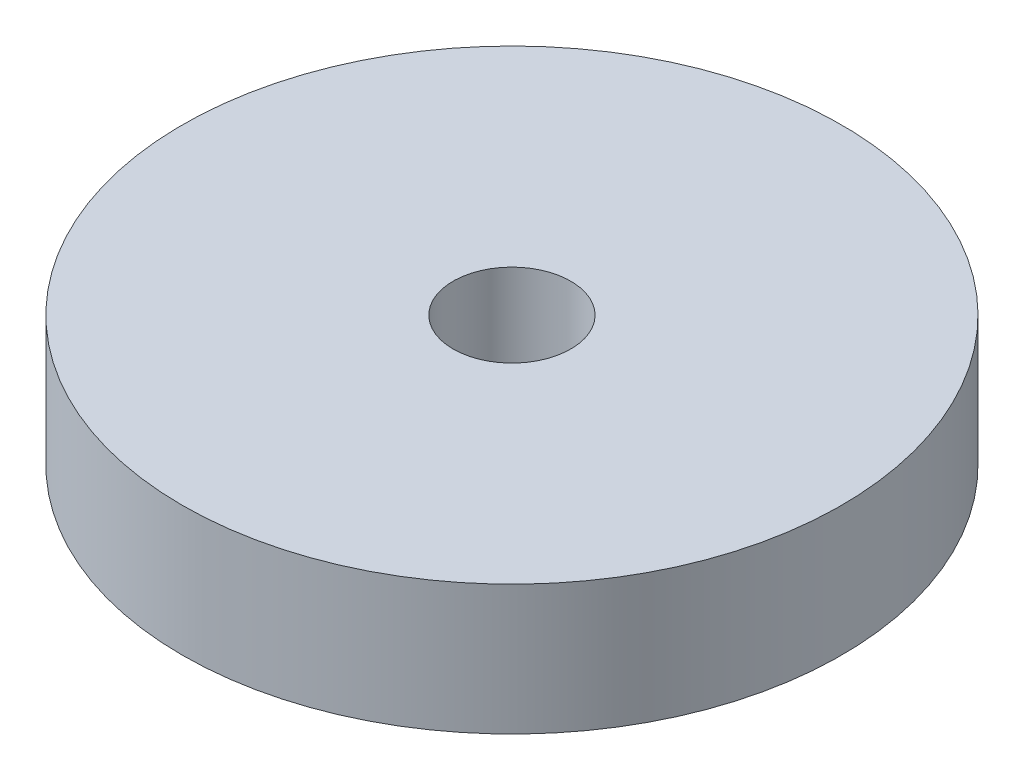
ISO-10303-21;
HEADER;
FILE_DESCRIPTION(('STEP AP214'),'2;1');
FILE_NAME('part.step','',(''),(''),'','','');
FILE_SCHEMA(('AUTOMOTIVE_DESIGN { 1 0 10303 214 1 1 1 1 }'));
ENDSEC;
DATA;
#1=APPLICATION_CONTEXT('core data for automotive mechanical design processes');
#2=APPLICATION_PROTOCOL_DEFINITION('international standard','automotive_design',2000,#1);
#3=PRODUCT_CONTEXT('',#1,'mechanical');
#4=PRODUCT('Part','Part','',(#3));
#5=PRODUCT_RELATED_PRODUCT_CATEGORY('part','',(#4));
#6=PRODUCT_DEFINITION_FORMATION('','',#4);
#7=PRODUCT_DEFINITION_CONTEXT('part definition',#1,'design');
#8=PRODUCT_DEFINITION('design','',#6,#7);
#9=PRODUCT_DEFINITION_SHAPE('','',#8);
#10=(LENGTH_UNIT() NAMED_UNIT(*) SI_UNIT(.MILLI.,.METRE.));
#11=(NAMED_UNIT(*) PLANE_ANGLE_UNIT() SI_UNIT($,.RADIAN.));
#12=(NAMED_UNIT(*) SI_UNIT($,.STERADIAN.) SOLID_ANGLE_UNIT());
#13=UNCERTAINTY_MEASURE_WITH_UNIT(LENGTH_MEASURE(1.E-05),#10,'distance_accuracy_value','');
#14=(GEOMETRIC_REPRESENTATION_CONTEXT(3) GLOBAL_UNCERTAINTY_ASSIGNED_CONTEXT((#13)) GLOBAL_UNIT_ASSIGNED_CONTEXT((#10,
#11,#12)) REPRESENTATION_CONTEXT('',''));
#15=CARTESIAN_POINT('',(0.,0.,0.));
#16=DIRECTION('',(0.,0.,1.));
#17=DIRECTION('',(1.,0.,0.));
#18=AXIS2_PLACEMENT_3D('',#15,#16,#17);
#19=CARTESIAN_POINT('',(0.,32.,0.));
#20=DIRECTION('',(0.,1.,0.));
#21=DIRECTION('',(0.,0.,1.));
#22=AXIS2_PLACEMENT_3D('',#19,#20,#21);
#23=PLANE('',#22);
#24=CARTESIAN_POINT('',(0.,32.,0.));
#25=DIRECTION('',(0.,1.,0.));
#26=DIRECTION('',(0.,0.,1.));
#27=AXIS2_PLACEMENT_3D('',#24,#25,#26);
#28=CIRCLE('',#27,162.5);
#29=CARTESIAN_POINT('',(0.,32.,162.5));
#30=VERTEX_POINT('',#29);
#31=EDGE_CURVE('E10',#30,#30,#28,.T.);
#32=ORIENTED_EDGE('',*,*,#31,.T.);
#33=EDGE_LOOP('',(#32));
#34=FACE_BOUND('',#33,.T.);
#35=CARTESIAN_POINT('',(0.,32.,0.));
#36=DIRECTION('',(0.,1.,0.));
#37=DIRECTION('',(0.,0.,1.));
#38=AXIS2_PLACEMENT_3D('',#35,#36,#37);
#39=CIRCLE('',#38,29.);
#40=CARTESIAN_POINT('',(0.,32.,29.));
#41=VERTEX_POINT('',#40);
#42=EDGE_CURVE('E42',#41,#41,#39,.T.);
#43=ORIENTED_EDGE('',*,*,#42,.F.);
#44=EDGE_LOOP('',(#43));
#45=FACE_BOUND('',#44,.T.);
#46=ADVANCED_FACE('F31',(#34,#45),#23,.T.);
#47=CARTESIAN_POINT('',(0.,-32.,0.));
#48=DIRECTION('',(0.,1.,0.));
#49=DIRECTION('',(0.,0.,1.));
#50=AXIS2_PLACEMENT_3D('',#47,#48,#49);
#51=PLANE('',#50);
#52=CARTESIAN_POINT('',(0.,-32.,0.));
#53=DIRECTION('',(0.,1.,0.));
#54=DIRECTION('',(0.,0.,1.));
#55=AXIS2_PLACEMENT_3D('',#52,#53,#54);
#56=CIRCLE('',#55,162.5);
#57=CARTESIAN_POINT('',(0.,-32.,162.5));
#58=VERTEX_POINT('',#57);
#59=EDGE_CURVE('E35',#58,#58,#56,.T.);
#60=ORIENTED_EDGE('',*,*,#59,.F.);
#61=EDGE_LOOP('',(#60));
#62=FACE_BOUND('',#61,.T.);
#63=CARTESIAN_POINT('',(0.,-32.,0.));
#64=DIRECTION('',(0.,1.,0.));
#65=DIRECTION('',(0.,0.,1.));
#66=AXIS2_PLACEMENT_3D('',#63,#64,#65);
#67=CIRCLE('',#66,29.);
#68=CARTESIAN_POINT('',(0.,-32.,29.));
#69=VERTEX_POINT('',#68);
#70=EDGE_CURVE('E44',#69,#69,#67,.T.);
#71=ORIENTED_EDGE('',*,*,#70,.T.);
#72=EDGE_LOOP('',(#71));
#73=FACE_BOUND('',#72,.T.);
#74=ADVANCED_FACE('F54',(#62,#73),#51,.F.);
#75=CARTESIAN_POINT('',(0.,32.,0.));
#76=DIRECTION('',(0.,-1.,0.));
#77=DIRECTION('',(0.,0.,-1.));
#78=AXIS2_PLACEMENT_3D('',#75,#76,#77);
#79=CYLINDRICAL_SURFACE('',#78,162.5);
#80=ORIENTED_EDGE('',*,*,#31,.F.);
#81=EDGE_LOOP('',(#80));
#82=FACE_BOUND('',#81,.T.);
#83=ORIENTED_EDGE('',*,*,#59,.T.);
#84=EDGE_LOOP('',(#83));
#85=FACE_BOUND('',#84,.T.);
#86=ADVANCED_FACE('F33',(#82,#85),#79,.T.);
#87=CARTESIAN_POINT('',(0.,32.,0.));
#88=DIRECTION('',(0.,-1.,0.));
#89=DIRECTION('',(0.,0.,-1.));
#90=AXIS2_PLACEMENT_3D('',#87,#88,#89);
#91=CYLINDRICAL_SURFACE('',#90,29.);
#92=ORIENTED_EDGE('',*,*,#42,.T.);
#93=EDGE_LOOP('',(#92));
#94=FACE_BOUND('',#93,.T.);
#95=ORIENTED_EDGE('',*,*,#70,.F.);
#96=EDGE_LOOP('',(#95));
#97=FACE_BOUND('',#96,.T.);
#98=ADVANCED_FACE('F50',(#94,#97),#91,.F.);
#99=CLOSED_SHELL('',(#46,#74,#86,#98));
#100=MANIFOLD_SOLID_BREP('B2',#99);
#101=ADVANCED_BREP_SHAPE_REPRESENTATION('',(#18,#100),#14);
#102=SHAPE_DEFINITION_REPRESENTATION(#9,#101);
ENDSEC;
END-ISO-10303-21;
